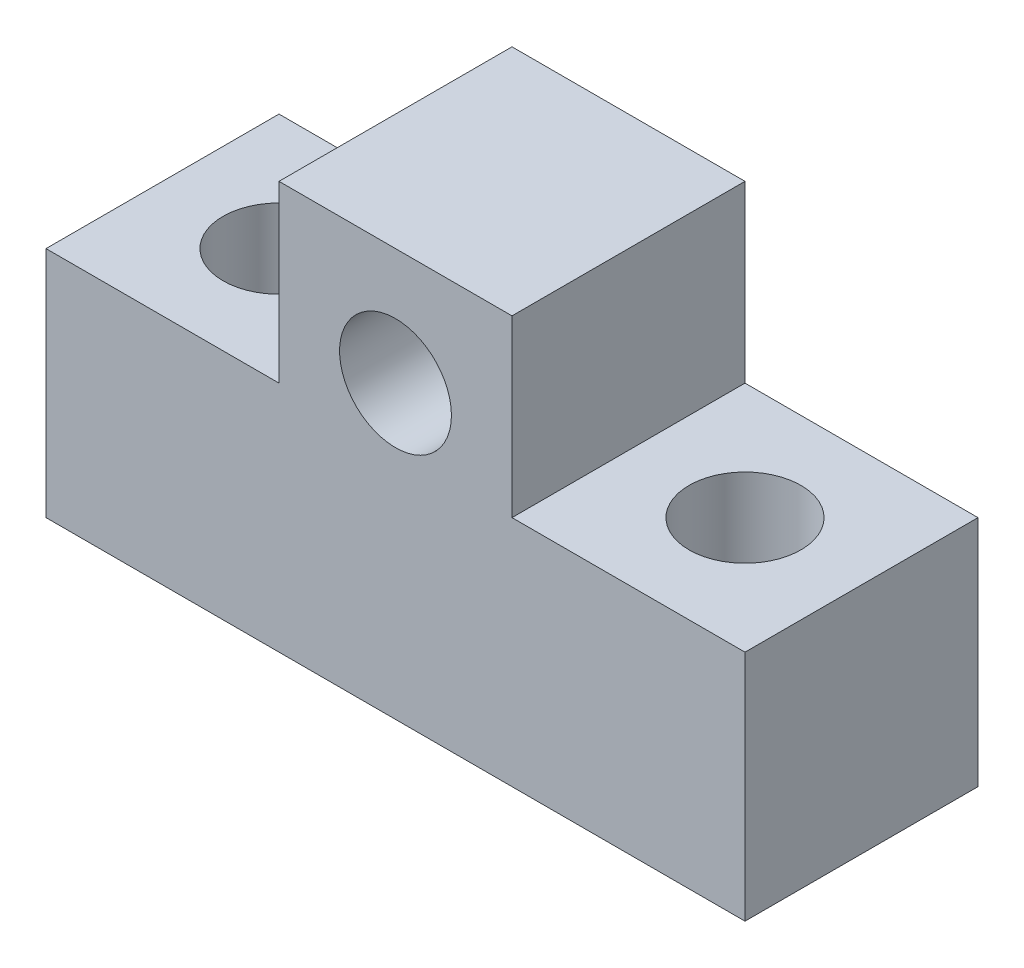
ISO-10303-21;
HEADER;
FILE_DESCRIPTION(('STEP AP214'),'2;1');
FILE_NAME('part.step','',(''),(''),'','','');
FILE_SCHEMA(('AUTOMOTIVE_DESIGN { 1 0 10303 214 1 1 1 1 }'));
ENDSEC;
DATA;
#1=APPLICATION_CONTEXT('core data for automotive mechanical design processes');
#2=APPLICATION_PROTOCOL_DEFINITION('international standard','automotive_design',2000,#1);
#3=PRODUCT_CONTEXT('',#1,'mechanical');
#4=PRODUCT('Part','Part','',(#3));
#5=PRODUCT_RELATED_PRODUCT_CATEGORY('part','',(#4));
#6=PRODUCT_DEFINITION_FORMATION('','',#4);
#7=PRODUCT_DEFINITION_CONTEXT('part definition',#1,'design');
#8=PRODUCT_DEFINITION('design','',#6,#7);
#9=PRODUCT_DEFINITION_SHAPE('','',#8);
#10=(LENGTH_UNIT() NAMED_UNIT(*) SI_UNIT(.MILLI.,.METRE.));
#11=(NAMED_UNIT(*) PLANE_ANGLE_UNIT() SI_UNIT($,.RADIAN.));
#12=(NAMED_UNIT(*) SI_UNIT($,.STERADIAN.) SOLID_ANGLE_UNIT());
#13=UNCERTAINTY_MEASURE_WITH_UNIT(LENGTH_MEASURE(1.E-05),#10,'distance_accuracy_value','');
#14=(GEOMETRIC_REPRESENTATION_CONTEXT(3) GLOBAL_UNCERTAINTY_ASSIGNED_CONTEXT((#13)) GLOBAL_UNIT_ASSIGNED_CONTEXT((#10,
#11,#12)) REPRESENTATION_CONTEXT('',''));
#15=CARTESIAN_POINT('',(0.,0.,0.));
#16=DIRECTION('',(0.,0.,1.));
#17=DIRECTION('',(1.,0.,0.));
#18=AXIS2_PLACEMENT_3D('',#15,#16,#17);
#19=CARTESIAN_POINT('',(-9.525,3.175,6.35));
#20=DIRECTION('',(0.,-1.,0.));
#21=DIRECTION('',(0.,0.,-1.));
#22=AXIS2_PLACEMENT_3D('',#19,#20,#21);
#23=PLANE('',#22);
#24=CARTESIAN_POINT('',(6.35,3.175,3.175));
#25=DIRECTION('',(0.,1.,0.));
#26=DIRECTION('',(0.,0.,1.));
#27=AXIS2_PLACEMENT_3D('',#24,#25,#26);
#28=CIRCLE('',#27,1.52399999999999);
#29=CARTESIAN_POINT('',(6.35,3.175,4.69899999999999));
#30=VERTEX_POINT('',#29);
#31=EDGE_CURVE('E225',#30,#30,#28,.T.);
#32=ORIENTED_EDGE('',*,*,#31,.F.);
#33=EDGE_LOOP('',(#32));
#34=FACE_BOUND('',#33,.T.);
#35=DIRECTION('',(0.,0.,-1.));
#36=VECTOR('',#35,1.);
#37=CARTESIAN_POINT('',(3.175,3.175,0.));
#38=LINE('',#37,#36);
#39=CARTESIAN_POINT('',(3.175,3.175,6.35));
#40=VERTEX_POINT('',#39);
#41=CARTESIAN_POINT('',(3.175,3.175,0.));
#42=VERTEX_POINT('',#41);
#43=EDGE_CURVE('E65',#40,#42,#38,.T.);
#44=ORIENTED_EDGE('',*,*,#43,.F.);
#45=DIRECTION('',(-1.,0.,0.));
#46=VECTOR('',#45,1.);
#47=CARTESIAN_POINT('',(-9.525,3.175,6.35));
#48=LINE('',#47,#46);
#49=CARTESIAN_POINT('',(9.525,3.175,6.35));
#50=VERTEX_POINT('',#49);
#51=EDGE_CURVE('E179',#50,#40,#48,.T.);
#52=ORIENTED_EDGE('',*,*,#51,.F.);
#53=DIRECTION('',(0.,0.,-1.));
#54=VECTOR('',#53,1.);
#55=CARTESIAN_POINT('',(9.525,3.175,6.35));
#56=LINE('',#55,#54);
#57=CARTESIAN_POINT('',(9.525,3.175,0.));
#58=VERTEX_POINT('',#57);
#59=EDGE_CURVE('E193',#50,#58,#56,.T.);
#60=ORIENTED_EDGE('',*,*,#59,.T.);
#61=DIRECTION('',(-1.,0.,0.));
#62=VECTOR('',#61,1.);
#63=CARTESIAN_POINT('',(-9.525,3.175,0.));
#64=LINE('',#63,#62);
#65=EDGE_CURVE('E172',#58,#42,#64,.T.);
#66=ORIENTED_EDGE('',*,*,#65,.T.);
#67=EDGE_LOOP('',(#44,#52,#60,#66));
#68=FACE_BOUND('',#67,.T.);
#69=ADVANCED_FACE('F46',(#34,#68),#23,.F.);
#70=CARTESIAN_POINT('',(-6.35,3.175,3.175));
#71=DIRECTION('',(0.,1.,0.));
#72=DIRECTION('',(0.,0.,1.));
#73=AXIS2_PLACEMENT_3D('',#70,#71,#72);
#74=CIRCLE('',#73,1.52399999999999);
#75=CARTESIAN_POINT('',(-6.35,3.175,4.69899999999999));
#76=VERTEX_POINT('',#75);
#77=EDGE_CURVE('E233',#76,#76,#74,.T.);
#78=ORIENTED_EDGE('',*,*,#77,.F.);
#79=EDGE_LOOP('',(#78));
#80=FACE_BOUND('',#79,.T.);
#81=DIRECTION('',(0.,0.,1.));
#82=VECTOR('',#81,1.);
#83=CARTESIAN_POINT('',(-3.175,3.175,0.));
#84=LINE('',#83,#82);
#85=CARTESIAN_POINT('',(-3.175,3.175,0.));
#86=VERTEX_POINT('',#85);
#87=CARTESIAN_POINT('',(-3.175,3.175,6.35));
#88=VERTEX_POINT('',#87);
#89=EDGE_CURVE('E75',#86,#88,#84,.T.);
#90=ORIENTED_EDGE('',*,*,#89,.F.);
#91=CARTESIAN_POINT('',(-9.525,3.175,0.));
#92=VERTEX_POINT('',#91);
#93=EDGE_CURVE('E188',#86,#92,#64,.T.);
#94=ORIENTED_EDGE('',*,*,#93,.T.);
#95=DIRECTION('',(0.,0.,-1.));
#96=VECTOR('',#95,1.);
#97=CARTESIAN_POINT('',(-9.525,3.175,6.35));
#98=LINE('',#97,#96);
#99=CARTESIAN_POINT('',(-9.525,3.175,6.35));
#100=VERTEX_POINT('',#99);
#101=EDGE_CURVE('E181',#100,#92,#98,.T.);
#102=ORIENTED_EDGE('',*,*,#101,.F.);
#103=EDGE_CURVE('E178',#88,#100,#48,.T.);
#104=ORIENTED_EDGE('',*,*,#103,.F.);
#105=EDGE_LOOP('',(#90,#94,#102,#104));
#106=FACE_BOUND('',#105,.T.);
#107=ADVANCED_FACE('F261',(#80,#106),#23,.F.);
#108=CARTESIAN_POINT('',(-9.525,3.175,6.35));
#109=DIRECTION('',(1.,0.,0.));
#110=DIRECTION('',(0.,0.,-1.));
#111=AXIS2_PLACEMENT_3D('',#108,#109,#110);
#112=PLANE('',#111);
#113=DIRECTION('',(0.,-1.,0.));
#114=VECTOR('',#113,1.);
#115=CARTESIAN_POINT('',(-9.525,3.175,0.));
#116=LINE('',#115,#114);
#117=CARTESIAN_POINT('',(-9.525,-3.175,0.));
#118=VERTEX_POINT('',#117);
#119=EDGE_CURVE('E155',#92,#118,#116,.T.);
#120=ORIENTED_EDGE('',*,*,#119,.T.);
#121=DIRECTION('',(0.,0.,-1.));
#122=VECTOR('',#121,1.);
#123=CARTESIAN_POINT('',(-9.525,-3.175,6.35));
#124=LINE('',#123,#122);
#125=CARTESIAN_POINT('',(-9.525,-3.175,6.35));
#126=VERTEX_POINT('',#125);
#127=EDGE_CURVE('E11',#126,#118,#124,.T.);
#128=ORIENTED_EDGE('',*,*,#127,.F.);
#129=DIRECTION('',(0.,-1.,0.));
#130=VECTOR('',#129,1.);
#131=CARTESIAN_POINT('',(-9.525,3.175,6.35));
#132=LINE('',#131,#130);
#133=EDGE_CURVE('E167',#100,#126,#132,.T.);
#134=ORIENTED_EDGE('',*,*,#133,.F.);
#135=ORIENTED_EDGE('',*,*,#101,.T.);
#136=EDGE_LOOP('',(#120,#128,#134,#135));
#137=FACE_BOUND('',#136,.T.);
#138=ADVANCED_FACE('F48',(#137),#112,.F.);
#139=CARTESIAN_POINT('',(-9.525,-3.175,6.35));
#140=DIRECTION('',(0.,1.,0.));
#141=DIRECTION('',(0.,0.,1.));
#142=AXIS2_PLACEMENT_3D('',#139,#140,#141);
#143=PLANE('',#142);
#144=CARTESIAN_POINT('',(-6.35,-3.175,3.175));
#145=DIRECTION('',(0.,1.,0.));
#146=DIRECTION('',(0.,0.,1.));
#147=AXIS2_PLACEMENT_3D('',#144,#145,#146);
#148=CIRCLE('',#147,1.524);
#149=CARTESIAN_POINT('',(-6.35,-3.175,4.699));
#150=VERTEX_POINT('',#149);
#151=EDGE_CURVE('E229',#150,#150,#148,.T.);
#152=ORIENTED_EDGE('',*,*,#151,.T.);
#153=EDGE_LOOP('',(#152));
#154=FACE_BOUND('',#153,.T.);
#155=CARTESIAN_POINT('',(6.35,-3.175,3.175));
#156=DIRECTION('',(0.,1.,0.));
#157=DIRECTION('',(0.,0.,1.));
#158=AXIS2_PLACEMENT_3D('',#155,#156,#157);
#159=CIRCLE('',#158,1.524);
#160=CARTESIAN_POINT('',(6.35,-3.175,4.699));
#161=VERTEX_POINT('',#160);
#162=EDGE_CURVE('E219',#161,#161,#159,.T.);
#163=ORIENTED_EDGE('',*,*,#162,.T.);
#164=EDGE_LOOP('',(#163));
#165=FACE_BOUND('',#164,.T.);
#166=DIRECTION('',(1.,0.,0.));
#167=VECTOR('',#166,1.);
#168=CARTESIAN_POINT('',(-9.525,-3.175,0.));
#169=LINE('',#168,#167);
#170=CARTESIAN_POINT('',(9.525,-3.175,0.));
#171=VERTEX_POINT('',#170);
#172=EDGE_CURVE('E160',#118,#171,#169,.T.);
#173=ORIENTED_EDGE('',*,*,#172,.T.);
#174=DIRECTION('',(0.,0.,-1.));
#175=VECTOR('',#174,1.);
#176=CARTESIAN_POINT('',(9.525,-3.175,6.35));
#177=LINE('',#176,#175);
#178=CARTESIAN_POINT('',(9.525,-3.175,6.35));
#179=VERTEX_POINT('',#178);
#180=EDGE_CURVE('E55',#179,#171,#177,.T.);
#181=ORIENTED_EDGE('',*,*,#180,.F.);
#182=DIRECTION('',(1.,0.,0.));
#183=VECTOR('',#182,1.);
#184=CARTESIAN_POINT('',(-9.525,-3.175,6.35));
#185=LINE('',#184,#183);
#186=EDGE_CURVE('E171',#126,#179,#185,.T.);
#187=ORIENTED_EDGE('',*,*,#186,.F.);
#188=ORIENTED_EDGE('',*,*,#127,.T.);
#189=EDGE_LOOP('',(#173,#181,#187,#188));
#190=FACE_BOUND('',#189,.T.);
#191=ADVANCED_FACE('F257',(#154,#165,#190),#143,.F.);
#192=CARTESIAN_POINT('',(9.525,3.175,6.35));
#193=DIRECTION('',(-1.,0.,0.));
#194=DIRECTION('',(0.,0.,1.));
#195=AXIS2_PLACEMENT_3D('',#192,#193,#194);
#196=PLANE('',#195);
#197=DIRECTION('',(0.,1.,0.));
#198=VECTOR('',#197,1.);
#199=CARTESIAN_POINT('',(9.525,3.175,0.));
#200=LINE('',#199,#198);
#201=EDGE_CURVE('E185',#171,#58,#200,.T.);
#202=ORIENTED_EDGE('',*,*,#201,.T.);
#203=ORIENTED_EDGE('',*,*,#59,.F.);
#204=DIRECTION('',(0.,1.,0.));
#205=VECTOR('',#204,1.);
#206=CARTESIAN_POINT('',(9.525,3.175,6.35));
#207=LINE('',#206,#205);
#208=EDGE_CURVE('E175',#179,#50,#207,.T.);
#209=ORIENTED_EDGE('',*,*,#208,.F.);
#210=ORIENTED_EDGE('',*,*,#180,.T.);
#211=EDGE_LOOP('',(#202,#203,#209,#210));
#212=FACE_BOUND('',#211,.T.);
#213=ADVANCED_FACE('F203',(#212),#196,.F.);
#214=CARTESIAN_POINT('',(0.,0.,6.35));
#215=DIRECTION('',(0.,0.,1.));
#216=DIRECTION('',(1.,0.,0.));
#217=AXIS2_PLACEMENT_3D('',#214,#215,#216);
#218=PLANE('',#217);
#219=CARTESIAN_POINT('',(0.,4.7625,6.35));
#220=DIRECTION('',(0.,0.,1.));
#221=DIRECTION('',(1.,0.,0.));
#222=AXIS2_PLACEMENT_3D('',#219,#220,#221);
#223=CIRCLE('',#222,1.52399999999999);
#224=CARTESIAN_POINT('',(1.52399999999999,4.7625,6.35));
#225=VERTEX_POINT('',#224);
#226=EDGE_CURVE('E241',#225,#225,#223,.T.);
#227=ORIENTED_EDGE('',*,*,#226,.F.);
#228=EDGE_LOOP('',(#227));
#229=FACE_BOUND('',#228,.T.);
#230=ORIENTED_EDGE('',*,*,#133,.T.);
#231=ORIENTED_EDGE('',*,*,#186,.T.);
#232=ORIENTED_EDGE('',*,*,#208,.T.);
#233=ORIENTED_EDGE('',*,*,#51,.T.);
#234=DIRECTION('',(0.,-1.,0.));
#235=VECTOR('',#234,1.);
#236=CARTESIAN_POINT('',(3.175,7.9375,6.35));
#237=LINE('',#236,#235);
#238=CARTESIAN_POINT('',(3.175,7.9375,6.35));
#239=VERTEX_POINT('',#238);
#240=EDGE_CURVE('E208',#239,#40,#237,.T.);
#241=ORIENTED_EDGE('',*,*,#240,.F.);
#242=DIRECTION('',(1.,0.,0.));
#243=VECTOR('',#242,1.);
#244=CARTESIAN_POINT('',(3.175,7.9375,6.35));
#245=LINE('',#244,#243);
#246=CARTESIAN_POINT('',(-3.175,7.9375,6.35));
#247=VERTEX_POINT('',#246);
#248=EDGE_CURVE('E147',#247,#239,#245,.T.);
#249=ORIENTED_EDGE('',*,*,#248,.F.);
#250=DIRECTION('',(0.,-1.,0.));
#251=VECTOR('',#250,1.);
#252=CARTESIAN_POINT('',(-3.175,7.9375,6.35));
#253=LINE('',#252,#251);
#254=EDGE_CURVE('E163',#247,#88,#253,.T.);
#255=ORIENTED_EDGE('',*,*,#254,.T.);
#256=ORIENTED_EDGE('',*,*,#103,.T.);
#257=EDGE_LOOP('',(#230,#231,#232,#233,#241,#249,#255,#256));
#258=FACE_BOUND('',#257,.T.);
#259=ADVANCED_FACE('F207',(#229,#258),#218,.T.);
#260=CARTESIAN_POINT('',(0.,0.,0.));
#261=DIRECTION('',(0.,0.,1.));
#262=DIRECTION('',(1.,0.,0.));
#263=AXIS2_PLACEMENT_3D('',#260,#261,#262);
#264=PLANE('',#263);
#265=CARTESIAN_POINT('',(0.,4.7625,0.));
#266=DIRECTION('',(0.,0.,1.));
#267=DIRECTION('',(1.,0.,0.));
#268=AXIS2_PLACEMENT_3D('',#265,#266,#267);
#269=CIRCLE('',#268,1.524);
#270=CARTESIAN_POINT('',(1.524,4.7625,0.));
#271=VERTEX_POINT('',#270);
#272=EDGE_CURVE('E237',#271,#271,#269,.T.);
#273=ORIENTED_EDGE('',*,*,#272,.T.);
#274=EDGE_LOOP('',(#273));
#275=FACE_BOUND('',#274,.T.);
#276=ORIENTED_EDGE('',*,*,#119,.F.);
#277=ORIENTED_EDGE('',*,*,#93,.F.);
#278=DIRECTION('',(0.,-1.,0.));
#279=VECTOR('',#278,1.);
#280=CARTESIAN_POINT('',(-3.175,7.9375,0.));
#281=LINE('',#280,#279);
#282=CARTESIAN_POINT('',(-3.175,7.9375,0.));
#283=VERTEX_POINT('',#282);
#284=EDGE_CURVE('E137',#283,#86,#281,.T.);
#285=ORIENTED_EDGE('',*,*,#284,.F.);
#286=DIRECTION('',(-1.,0.,0.));
#287=VECTOR('',#286,1.);
#288=CARTESIAN_POINT('',(3.175,7.9375,0.));
#289=LINE('',#288,#287);
#290=CARTESIAN_POINT('',(3.175,7.9375,0.));
#291=VERTEX_POINT('',#290);
#292=EDGE_CURVE('E129',#291,#283,#289,.T.);
#293=ORIENTED_EDGE('',*,*,#292,.F.);
#294=DIRECTION('',(0.,-1.,0.));
#295=VECTOR('',#294,1.);
#296=CARTESIAN_POINT('',(3.175,7.9375,0.));
#297=LINE('',#296,#295);
#298=EDGE_CURVE('E135',#291,#42,#297,.T.);
#299=ORIENTED_EDGE('',*,*,#298,.T.);
#300=ORIENTED_EDGE('',*,*,#65,.F.);
#301=ORIENTED_EDGE('',*,*,#201,.F.);
#302=ORIENTED_EDGE('',*,*,#172,.F.);
#303=EDGE_LOOP('',(#276,#277,#285,#293,#299,#300,#301,#302));
#304=FACE_BOUND('',#303,.T.);
#305=ADVANCED_FACE('F132',(#275,#304),#264,.F.);
#306=CARTESIAN_POINT('',(3.175,7.9375,0.));
#307=DIRECTION('',(-1.,0.,0.));
#308=DIRECTION('',(0.,0.,1.));
#309=AXIS2_PLACEMENT_3D('',#306,#307,#308);
#310=PLANE('',#309);
#311=ORIENTED_EDGE('',*,*,#43,.T.);
#312=ORIENTED_EDGE('',*,*,#298,.F.);
#313=DIRECTION('',(0.,0.,-1.));
#314=VECTOR('',#313,1.);
#315=CARTESIAN_POINT('',(3.175,7.9375,0.));
#316=LINE('',#315,#314);
#317=EDGE_CURVE('E142',#239,#291,#316,.T.);
#318=ORIENTED_EDGE('',*,*,#317,.F.);
#319=ORIENTED_EDGE('',*,*,#240,.T.);
#320=EDGE_LOOP('',(#311,#312,#318,#319));
#321=FACE_BOUND('',#320,.T.);
#322=ADVANCED_FACE('F153',(#321),#310,.F.);
#323=CARTESIAN_POINT('',(-3.175,7.9375,0.));
#324=DIRECTION('',(1.,0.,0.));
#325=DIRECTION('',(0.,0.,-1.));
#326=AXIS2_PLACEMENT_3D('',#323,#324,#325);
#327=PLANE('',#326);
#328=ORIENTED_EDGE('',*,*,#89,.T.);
#329=ORIENTED_EDGE('',*,*,#254,.F.);
#330=DIRECTION('',(0.,0.,1.));
#331=VECTOR('',#330,1.);
#332=CARTESIAN_POINT('',(-3.175,7.9375,0.));
#333=LINE('',#332,#331);
#334=EDGE_CURVE('E141',#283,#247,#333,.T.);
#335=ORIENTED_EDGE('',*,*,#334,.F.);
#336=ORIENTED_EDGE('',*,*,#284,.T.);
#337=EDGE_LOOP('',(#328,#329,#335,#336));
#338=FACE_BOUND('',#337,.T.);
#339=ADVANCED_FACE('F282',(#338),#327,.F.);
#340=CARTESIAN_POINT('',(0.,7.9375,0.));
#341=DIRECTION('',(0.,-1.,0.));
#342=DIRECTION('',(0.,0.,-1.));
#343=AXIS2_PLACEMENT_3D('',#340,#341,#342);
#344=PLANE('',#343);
#345=ORIENTED_EDGE('',*,*,#317,.T.);
#346=ORIENTED_EDGE('',*,*,#292,.T.);
#347=ORIENTED_EDGE('',*,*,#334,.T.);
#348=ORIENTED_EDGE('',*,*,#248,.T.);
#349=EDGE_LOOP('',(#345,#346,#347,#348));
#350=FACE_BOUND('',#349,.T.);
#351=ADVANCED_FACE('F145',(#350),#344,.F.);
#352=CARTESIAN_POINT('',(6.35,3.175,3.175));
#353=DIRECTION('',(0.,1.,0.));
#354=DIRECTION('',(0.,0.,1.));
#355=AXIS2_PLACEMENT_3D('',#352,#353,#354);
#356=CYLINDRICAL_SURFACE('',#355,1.52399999999999);
#357=ORIENTED_EDGE('',*,*,#162,.F.);
#358=EDGE_LOOP('',(#357));
#359=FACE_BOUND('',#358,.T.);
#360=ORIENTED_EDGE('',*,*,#31,.T.);
#361=EDGE_LOOP('',(#360));
#362=FACE_BOUND('',#361,.T.);
#363=ADVANCED_FACE('F291',(#359,#362),#356,.F.);
#364=CARTESIAN_POINT('',(-6.35,3.175,3.175));
#365=DIRECTION('',(0.,1.,0.));
#366=DIRECTION('',(0.,0.,1.));
#367=AXIS2_PLACEMENT_3D('',#364,#365,#366);
#368=CYLINDRICAL_SURFACE('',#367,1.52399999999999);
#369=ORIENTED_EDGE('',*,*,#151,.F.);
#370=EDGE_LOOP('',(#369));
#371=FACE_BOUND('',#370,.T.);
#372=ORIENTED_EDGE('',*,*,#77,.T.);
#373=EDGE_LOOP('',(#372));
#374=FACE_BOUND('',#373,.T.);
#375=ADVANCED_FACE('F296',(#371,#374),#368,.F.);
#376=CARTESIAN_POINT('',(0.,4.7625,6.35));
#377=DIRECTION('',(0.,0.,1.));
#378=DIRECTION('',(1.,0.,0.));
#379=AXIS2_PLACEMENT_3D('',#376,#377,#378);
#380=CYLINDRICAL_SURFACE('',#379,1.52399999999999);
#381=ORIENTED_EDGE('',*,*,#272,.F.);
#382=EDGE_LOOP('',(#381));
#383=FACE_BOUND('',#382,.T.);
#384=ORIENTED_EDGE('',*,*,#226,.T.);
#385=EDGE_LOOP('',(#384));
#386=FACE_BOUND('',#385,.T.);
#387=ADVANCED_FACE('F247',(#383,#386),#380,.F.);
#388=CLOSED_SHELL('',(#69,#107,#138,#191,#213,#259,#305,#322,#339,#351,#363,#375,#387));
#389=MANIFOLD_SOLID_BREP('B2',#388);
#390=ADVANCED_BREP_SHAPE_REPRESENTATION('',(#18,#389),#14);
#391=SHAPE_DEFINITION_REPRESENTATION(#9,#390);
ENDSEC;
END-ISO-10303-21;
